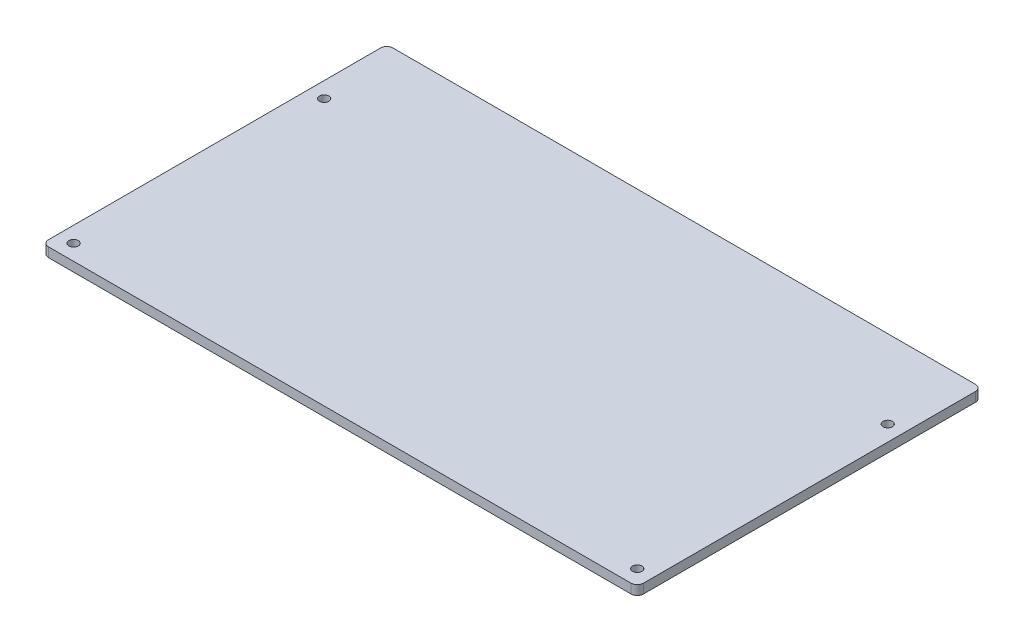
ISO-10303-21;
HEADER;
FILE_DESCRIPTION(('STEP AP214'),'2;1');
FILE_NAME('part.step','',(''),(''),'','','');
FILE_SCHEMA(('AUTOMOTIVE_DESIGN { 1 0 10303 214 1 1 1 1 }'));
ENDSEC;
DATA;
#1=APPLICATION_CONTEXT('core data for automotive mechanical design processes');
#2=APPLICATION_PROTOCOL_DEFINITION('international standard','automotive_design',2000,#1);
#3=PRODUCT_CONTEXT('',#1,'mechanical');
#4=PRODUCT('Part','Part','',(#3));
#5=PRODUCT_RELATED_PRODUCT_CATEGORY('part','',(#4));
#6=PRODUCT_DEFINITION_FORMATION('','',#4);
#7=PRODUCT_DEFINITION_CONTEXT('part definition',#1,'design');
#8=PRODUCT_DEFINITION('design','',#6,#7);
#9=PRODUCT_DEFINITION_SHAPE('','',#8);
#10=(LENGTH_UNIT() NAMED_UNIT(*) SI_UNIT(.MILLI.,.METRE.));
#11=(NAMED_UNIT(*) PLANE_ANGLE_UNIT() SI_UNIT($,.RADIAN.));
#12=(NAMED_UNIT(*) SI_UNIT($,.STERADIAN.) SOLID_ANGLE_UNIT());
#13=UNCERTAINTY_MEASURE_WITH_UNIT(LENGTH_MEASURE(1.E-05),#10,'distance_accuracy_value','');
#14=(GEOMETRIC_REPRESENTATION_CONTEXT(3) GLOBAL_UNCERTAINTY_ASSIGNED_CONTEXT((#13)) GLOBAL_UNIT_ASSIGNED_CONTEXT((#10,
#11,#12)) REPRESENTATION_CONTEXT('',''));
#15=CARTESIAN_POINT('',(0.,0.,0.));
#16=DIRECTION('',(0.,0.,1.));
#17=DIRECTION('',(1.,0.,0.));
#18=AXIS2_PLACEMENT_3D('',#15,#16,#17);
#19=CARTESIAN_POINT('',(-95.,3.,-55.));
#20=DIRECTION('',(1.,0.,0.));
#21=DIRECTION('',(0.,0.,-1.));
#22=AXIS2_PLACEMENT_3D('',#19,#20,#21);
#23=PLANE('',#22);
#24=DIRECTION('',(0.,0.,1.));
#25=VECTOR('',#24,1.);
#26=CARTESIAN_POINT('',(-95.,0.,-55.));
#27=LINE('',#26,#25);
#28=CARTESIAN_POINT('',(-95.,0.,-53.));
#29=VERTEX_POINT('',#28);
#30=CARTESIAN_POINT('',(-95.,0.,53.));
#31=VERTEX_POINT('',#30);
#32=EDGE_CURVE('E143',#29,#31,#27,.T.);
#33=ORIENTED_EDGE('',*,*,#32,.T.);
#34=DIRECTION('',(0.,-1.,0.));
#35=VECTOR('',#34,1.);
#36=CARTESIAN_POINT('',(-95.,3.,53.));
#37=LINE('',#36,#35);
#38=CARTESIAN_POINT('',(-95.,3.,53.));
#39=VERTEX_POINT('',#38);
#40=EDGE_CURVE('E13',#31,#39,#37,.F.);
#41=ORIENTED_EDGE('',*,*,#40,.T.);
#42=DIRECTION('',(0.,0.,1.));
#43=VECTOR('',#42,1.);
#44=CARTESIAN_POINT('',(-95.,3.,-55.));
#45=LINE('',#44,#43);
#46=CARTESIAN_POINT('',(-95.,3.,-53.));
#47=VERTEX_POINT('',#46);
#48=EDGE_CURVE('E141',#47,#39,#45,.T.);
#49=ORIENTED_EDGE('',*,*,#48,.F.);
#50=DIRECTION('',(0.,-1.,0.));
#51=VECTOR('',#50,1.);
#52=CARTESIAN_POINT('',(-95.,3.,-53.));
#53=LINE('',#52,#51);
#54=EDGE_CURVE('E55',#47,#29,#53,.T.);
#55=ORIENTED_EDGE('',*,*,#54,.T.);
#56=EDGE_LOOP('',(#33,#41,#49,#55));
#57=FACE_BOUND('',#56,.T.);
#58=ADVANCED_FACE('F47',(#57),#23,.F.);
#59=CARTESIAN_POINT('',(-95.,3.,55.));
#60=DIRECTION('',(0.,0.,-1.));
#61=DIRECTION('',(-1.,0.,0.));
#62=AXIS2_PLACEMENT_3D('',#59,#60,#61);
#63=PLANE('',#62);
#64=DIRECTION('',(1.,0.,0.));
#65=VECTOR('',#64,1.);
#66=CARTESIAN_POINT('',(-95.,0.,55.));
#67=LINE('',#66,#65);
#68=CARTESIAN_POINT('',(-93.,0.,55.));
#69=VERTEX_POINT('',#68);
#70=CARTESIAN_POINT('',(93.,0.,55.));
#71=VERTEX_POINT('',#70);
#72=EDGE_CURVE('E139',#69,#71,#67,.T.);
#73=ORIENTED_EDGE('',*,*,#72,.T.);
#74=DIRECTION('',(0.,-1.,0.));
#75=VECTOR('',#74,1.);
#76=CARTESIAN_POINT('',(93.,3.,55.));
#77=LINE('',#76,#75);
#78=CARTESIAN_POINT('',(93.,3.,55.));
#79=VERTEX_POINT('',#78);
#80=EDGE_CURVE('E118',#71,#79,#77,.F.);
#81=ORIENTED_EDGE('',*,*,#80,.T.);
#82=DIRECTION('',(1.,0.,0.));
#83=VECTOR('',#82,1.);
#84=CARTESIAN_POINT('',(-95.,3.,55.));
#85=LINE('',#84,#83);
#86=CARTESIAN_POINT('',(-93.,3.,55.));
#87=VERTEX_POINT('',#86);
#88=EDGE_CURVE('E183',#87,#79,#85,.T.);
#89=ORIENTED_EDGE('',*,*,#88,.F.);
#90=DIRECTION('',(0.,-1.,0.));
#91=VECTOR('',#90,1.);
#92=CARTESIAN_POINT('',(-93.,3.,55.));
#93=LINE('',#92,#91);
#94=EDGE_CURVE('E123',#87,#69,#93,.T.);
#95=ORIENTED_EDGE('',*,*,#94,.T.);
#96=EDGE_LOOP('',(#73,#81,#89,#95));
#97=FACE_BOUND('',#96,.T.);
#98=ADVANCED_FACE('F231',(#97),#63,.F.);
#99=CARTESIAN_POINT('',(95.,3.,-55.));
#100=DIRECTION('',(-1.,0.,0.));
#101=DIRECTION('',(0.,0.,1.));
#102=AXIS2_PLACEMENT_3D('',#99,#100,#101);
#103=PLANE('',#102);
#104=DIRECTION('',(0.,0.,-1.));
#105=VECTOR('',#104,1.);
#106=CARTESIAN_POINT('',(95.,3.,-55.));
#107=LINE('',#106,#105);
#108=CARTESIAN_POINT('',(95.,3.,53.));
#109=VERTEX_POINT('',#108);
#110=CARTESIAN_POINT('',(95.,3.,-53.));
#111=VERTEX_POINT('',#110);
#112=EDGE_CURVE('E132',#109,#111,#107,.T.);
#113=ORIENTED_EDGE('',*,*,#112,.F.);
#114=DIRECTION('',(0.,-1.,0.));
#115=VECTOR('',#114,1.);
#116=CARTESIAN_POINT('',(95.,3.,53.));
#117=LINE('',#116,#115);
#118=CARTESIAN_POINT('',(95.,0.,53.));
#119=VERTEX_POINT('',#118);
#120=EDGE_CURVE('E117',#109,#119,#117,.T.);
#121=ORIENTED_EDGE('',*,*,#120,.T.);
#122=DIRECTION('',(0.,0.,-1.));
#123=VECTOR('',#122,1.);
#124=CARTESIAN_POINT('',(95.,0.,-55.));
#125=LINE('',#124,#123);
#126=CARTESIAN_POINT('',(95.,0.,-53.));
#127=VERTEX_POINT('',#126);
#128=EDGE_CURVE('E130',#119,#127,#125,.T.);
#129=ORIENTED_EDGE('',*,*,#128,.T.);
#130=DIRECTION('',(0.,-1.,0.));
#131=VECTOR('',#130,1.);
#132=CARTESIAN_POINT('',(95.,3.,-53.));
#133=LINE('',#132,#131);
#134=EDGE_CURVE('E134',#127,#111,#133,.F.);
#135=ORIENTED_EDGE('',*,*,#134,.T.);
#136=EDGE_LOOP('',(#113,#121,#129,#135));
#137=FACE_BOUND('',#136,.T.);
#138=ADVANCED_FACE('F129',(#137),#103,.F.);
#139=CARTESIAN_POINT('',(-95.,3.,-55.));
#140=DIRECTION('',(0.,0.,1.));
#141=DIRECTION('',(1.,0.,0.));
#142=AXIS2_PLACEMENT_3D('',#139,#140,#141);
#143=PLANE('',#142);
#144=DIRECTION('',(-1.,0.,0.));
#145=VECTOR('',#144,1.);
#146=CARTESIAN_POINT('',(-95.,3.,-55.));
#147=LINE('',#146,#145);
#148=CARTESIAN_POINT('',(93.,3.,-55.));
#149=VERTEX_POINT('',#148);
#150=CARTESIAN_POINT('',(-93.,3.,-55.));
#151=VERTEX_POINT('',#150);
#152=EDGE_CURVE('E147',#149,#151,#147,.T.);
#153=ORIENTED_EDGE('',*,*,#152,.F.);
#154=DIRECTION('',(0.,-1.,0.));
#155=VECTOR('',#154,1.);
#156=CARTESIAN_POINT('',(93.,3.,-55.));
#157=LINE('',#156,#155);
#158=CARTESIAN_POINT('',(93.,0.,-55.));
#159=VERTEX_POINT('',#158);
#160=EDGE_CURVE('E164',#149,#159,#157,.T.);
#161=ORIENTED_EDGE('',*,*,#160,.T.);
#162=DIRECTION('',(-1.,0.,0.));
#163=VECTOR('',#162,1.);
#164=CARTESIAN_POINT('',(-95.,0.,-55.));
#165=LINE('',#164,#163);
#166=CARTESIAN_POINT('',(-93.,0.,-55.));
#167=VERTEX_POINT('',#166);
#168=EDGE_CURVE('E138',#159,#167,#165,.T.);
#169=ORIENTED_EDGE('',*,*,#168,.T.);
#170=DIRECTION('',(0.,-1.,0.));
#171=VECTOR('',#170,1.);
#172=CARTESIAN_POINT('',(-93.,3.,-55.));
#173=LINE('',#172,#171);
#174=EDGE_CURVE('E62',#167,#151,#173,.F.);
#175=ORIENTED_EDGE('',*,*,#174,.T.);
#176=EDGE_LOOP('',(#153,#161,#169,#175));
#177=FACE_BOUND('',#176,.T.);
#178=ADVANCED_FACE('F220',(#177),#143,.F.);
#179=CARTESIAN_POINT('',(0.,3.,0.));
#180=DIRECTION('',(0.,1.,0.));
#181=DIRECTION('',(0.,0.,1.));
#182=AXIS2_PLACEMENT_3D('',#179,#180,#181);
#183=PLANE('',#182);
#184=CARTESIAN_POINT('',(-90.,3.,-30.));
#185=DIRECTION('',(0.,1.,0.));
#186=DIRECTION('',(0.,0.,1.));
#187=AXIS2_PLACEMENT_3D('',#184,#185,#186);
#188=CIRCLE('',#187,1.5);
#189=CARTESIAN_POINT('',(-90.,3.,-28.5));
#190=VERTEX_POINT('',#189);
#191=EDGE_CURVE('E202',#190,#190,#188,.T.);
#192=ORIENTED_EDGE('',*,*,#191,.F.);
#193=EDGE_LOOP('',(#192));
#194=FACE_BOUND('',#193,.T.);
#195=CARTESIAN_POINT('',(90.,3.,-30.));
#196=DIRECTION('',(0.,1.,0.));
#197=DIRECTION('',(0.,0.,1.));
#198=AXIS2_PLACEMENT_3D('',#195,#196,#197);
#199=CIRCLE('',#198,1.5);
#200=CARTESIAN_POINT('',(90.,3.,-28.5));
#201=VERTEX_POINT('',#200);
#202=EDGE_CURVE('E196',#201,#201,#199,.T.);
#203=ORIENTED_EDGE('',*,*,#202,.F.);
#204=EDGE_LOOP('',(#203));
#205=FACE_BOUND('',#204,.T.);
#206=CARTESIAN_POINT('',(90.,3.,50.));
#207=DIRECTION('',(0.,1.,0.));
#208=DIRECTION('',(0.,0.,1.));
#209=AXIS2_PLACEMENT_3D('',#206,#207,#208);
#210=CIRCLE('',#209,1.5);
#211=CARTESIAN_POINT('',(90.,3.,51.5));
#212=VERTEX_POINT('',#211);
#213=EDGE_CURVE('E190',#212,#212,#210,.T.);
#214=ORIENTED_EDGE('',*,*,#213,.F.);
#215=EDGE_LOOP('',(#214));
#216=FACE_BOUND('',#215,.T.);
#217=CARTESIAN_POINT('',(-90.,3.,50.));
#218=DIRECTION('',(0.,1.,0.));
#219=DIRECTION('',(0.,0.,1.));
#220=AXIS2_PLACEMENT_3D('',#217,#218,#219);
#221=CIRCLE('',#220,1.5);
#222=CARTESIAN_POINT('',(-90.,3.,51.5));
#223=VERTEX_POINT('',#222);
#224=EDGE_CURVE('E178',#223,#223,#221,.T.);
#225=ORIENTED_EDGE('',*,*,#224,.F.);
#226=EDGE_LOOP('',(#225));
#227=FACE_BOUND('',#226,.T.);
#228=ORIENTED_EDGE('',*,*,#88,.T.);
#229=CARTESIAN_POINT('',(93.,3.,53.));
#230=DIRECTION('',(0.,1.,0.));
#231=DIRECTION('',(0.,0.,1.));
#232=AXIS2_PLACEMENT_3D('',#229,#230,#231);
#233=CIRCLE('',#232,2.);
#234=EDGE_CURVE('E161',#79,#109,#233,.T.);
#235=ORIENTED_EDGE('',*,*,#234,.T.);
#236=ORIENTED_EDGE('',*,*,#112,.T.);
#237=CARTESIAN_POINT('',(93.,3.,-53.));
#238=DIRECTION('',(0.,1.,0.));
#239=DIRECTION('',(0.,0.,1.));
#240=AXIS2_PLACEMENT_3D('',#237,#238,#239);
#241=CIRCLE('',#240,2.);
#242=EDGE_CURVE('E69',#111,#149,#241,.T.);
#243=ORIENTED_EDGE('',*,*,#242,.T.);
#244=ORIENTED_EDGE('',*,*,#152,.T.);
#245=CARTESIAN_POINT('',(-93.,3.,-53.));
#246=DIRECTION('',(0.,1.,0.));
#247=DIRECTION('',(0.,0.,1.));
#248=AXIS2_PLACEMENT_3D('',#245,#246,#247);
#249=CIRCLE('',#248,2.);
#250=EDGE_CURVE('E156',#151,#47,#249,.T.);
#251=ORIENTED_EDGE('',*,*,#250,.T.);
#252=ORIENTED_EDGE('',*,*,#48,.T.);
#253=CARTESIAN_POINT('',(-93.,3.,53.));
#254=DIRECTION('',(0.,1.,0.));
#255=DIRECTION('',(0.,0.,1.));
#256=AXIS2_PLACEMENT_3D('',#253,#254,#255);
#257=CIRCLE('',#256,2.);
#258=EDGE_CURVE('E158',#39,#87,#257,.T.);
#259=ORIENTED_EDGE('',*,*,#258,.T.);
#260=EDGE_LOOP('',(#228,#235,#236,#243,#244,#251,#252,#259));
#261=FACE_BOUND('',#260,.T.);
#262=ADVANCED_FACE('F217',(#194,#205,#216,#227,#261),#183,.T.);
#263=CARTESIAN_POINT('',(0.,0.,0.));
#264=DIRECTION('',(0.,1.,0.));
#265=DIRECTION('',(0.,0.,1.));
#266=AXIS2_PLACEMENT_3D('',#263,#264,#265);
#267=PLANE('',#266);
#268=CARTESIAN_POINT('',(-90.,0.,-30.));
#269=DIRECTION('',(0.,1.,0.));
#270=DIRECTION('',(0.,0.,1.));
#271=AXIS2_PLACEMENT_3D('',#268,#269,#270);
#272=CIRCLE('',#271,1.5);
#273=CARTESIAN_POINT('',(-90.,0.,-28.5));
#274=VERTEX_POINT('',#273);
#275=EDGE_CURVE('E188',#274,#274,#272,.T.);
#276=ORIENTED_EDGE('',*,*,#275,.T.);
#277=EDGE_LOOP('',(#276));
#278=FACE_BOUND('',#277,.T.);
#279=CARTESIAN_POINT('',(90.,0.,-30.));
#280=DIRECTION('',(0.,1.,0.));
#281=DIRECTION('',(0.,0.,1.));
#282=AXIS2_PLACEMENT_3D('',#279,#280,#281);
#283=CIRCLE('',#282,1.5);
#284=CARTESIAN_POINT('',(90.,0.,-28.5));
#285=VERTEX_POINT('',#284);
#286=EDGE_CURVE('E199',#285,#285,#283,.T.);
#287=ORIENTED_EDGE('',*,*,#286,.T.);
#288=EDGE_LOOP('',(#287));
#289=FACE_BOUND('',#288,.T.);
#290=CARTESIAN_POINT('',(90.,0.,50.));
#291=DIRECTION('',(0.,1.,0.));
#292=DIRECTION('',(0.,0.,1.));
#293=AXIS2_PLACEMENT_3D('',#290,#291,#292);
#294=CIRCLE('',#293,1.5);
#295=CARTESIAN_POINT('',(90.,0.,51.5));
#296=VERTEX_POINT('',#295);
#297=EDGE_CURVE('E193',#296,#296,#294,.T.);
#298=ORIENTED_EDGE('',*,*,#297,.T.);
#299=EDGE_LOOP('',(#298));
#300=FACE_BOUND('',#299,.T.);
#301=CARTESIAN_POINT('',(-90.,0.,50.));
#302=DIRECTION('',(0.,1.,0.));
#303=DIRECTION('',(0.,0.,1.));
#304=AXIS2_PLACEMENT_3D('',#301,#302,#303);
#305=CIRCLE('',#304,1.5);
#306=CARTESIAN_POINT('',(-90.,0.,51.5));
#307=VERTEX_POINT('',#306);
#308=EDGE_CURVE('E176',#307,#307,#305,.T.);
#309=ORIENTED_EDGE('',*,*,#308,.T.);
#310=EDGE_LOOP('',(#309));
#311=FACE_BOUND('',#310,.T.);
#312=ORIENTED_EDGE('',*,*,#128,.F.);
#313=CARTESIAN_POINT('',(93.,0.,53.));
#314=DIRECTION('',(0.,1.,0.));
#315=DIRECTION('',(0.,0.,1.));
#316=AXIS2_PLACEMENT_3D('',#313,#314,#315);
#317=CIRCLE('',#316,2.);
#318=EDGE_CURVE('E113',#119,#71,#317,.F.);
#319=ORIENTED_EDGE('',*,*,#318,.T.);
#320=ORIENTED_EDGE('',*,*,#72,.F.);
#321=CARTESIAN_POINT('',(-93.,0.,53.));
#322=DIRECTION('',(0.,1.,0.));
#323=DIRECTION('',(0.,0.,1.));
#324=AXIS2_PLACEMENT_3D('',#321,#322,#323);
#325=CIRCLE('',#324,2.);
#326=EDGE_CURVE('E150',#69,#31,#325,.F.);
#327=ORIENTED_EDGE('',*,*,#326,.T.);
#328=ORIENTED_EDGE('',*,*,#32,.F.);
#329=CARTESIAN_POINT('',(-93.,0.,-53.));
#330=DIRECTION('',(0.,1.,0.));
#331=DIRECTION('',(0.,0.,1.));
#332=AXIS2_PLACEMENT_3D('',#329,#330,#331);
#333=CIRCLE('',#332,2.);
#334=EDGE_CURVE('E133',#29,#167,#333,.F.);
#335=ORIENTED_EDGE('',*,*,#334,.T.);
#336=ORIENTED_EDGE('',*,*,#168,.F.);
#337=CARTESIAN_POINT('',(93.,0.,-53.));
#338=DIRECTION('',(0.,1.,0.));
#339=DIRECTION('',(0.,0.,1.));
#340=AXIS2_PLACEMENT_3D('',#337,#338,#339);
#341=CIRCLE('',#340,2.);
#342=EDGE_CURVE('E124',#159,#127,#341,.F.);
#343=ORIENTED_EDGE('',*,*,#342,.T.);
#344=EDGE_LOOP('',(#312,#319,#320,#327,#328,#335,#336,#343));
#345=FACE_BOUND('',#344,.T.);
#346=ADVANCED_FACE('F136',(#278,#289,#300,#311,#345),#267,.F.);
#347=CARTESIAN_POINT('',(-90.,0.,50.));
#348=DIRECTION('',(0.,1.,0.));
#349=DIRECTION('',(0.,0.,1.));
#350=AXIS2_PLACEMENT_3D('',#347,#348,#349);
#351=CYLINDRICAL_SURFACE('',#350,1.5);
#352=ORIENTED_EDGE('',*,*,#308,.F.);
#353=EDGE_LOOP('',(#352));
#354=FACE_BOUND('',#353,.T.);
#355=ORIENTED_EDGE('',*,*,#224,.T.);
#356=EDGE_LOOP('',(#355));
#357=FACE_BOUND('',#356,.T.);
#358=ADVANCED_FACE('F261',(#354,#357),#351,.F.);
#359=CARTESIAN_POINT('',(90.,0.,50.));
#360=DIRECTION('',(0.,1.,0.));
#361=DIRECTION('',(0.,0.,1.));
#362=AXIS2_PLACEMENT_3D('',#359,#360,#361);
#363=CYLINDRICAL_SURFACE('',#362,1.5);
#364=ORIENTED_EDGE('',*,*,#297,.F.);
#365=EDGE_LOOP('',(#364));
#366=FACE_BOUND('',#365,.T.);
#367=ORIENTED_EDGE('',*,*,#213,.T.);
#368=EDGE_LOOP('',(#367));
#369=FACE_BOUND('',#368,.T.);
#370=ADVANCED_FACE('F265',(#366,#369),#363,.F.);
#371=CARTESIAN_POINT('',(90.,0.,-30.));
#372=DIRECTION('',(0.,1.,0.));
#373=DIRECTION('',(0.,0.,1.));
#374=AXIS2_PLACEMENT_3D('',#371,#372,#373);
#375=CYLINDRICAL_SURFACE('',#374,1.5);
#376=ORIENTED_EDGE('',*,*,#286,.F.);
#377=EDGE_LOOP('',(#376));
#378=FACE_BOUND('',#377,.T.);
#379=ORIENTED_EDGE('',*,*,#202,.T.);
#380=EDGE_LOOP('',(#379));
#381=FACE_BOUND('',#380,.T.);
#382=ADVANCED_FACE('F213',(#378,#381),#375,.F.);
#383=CARTESIAN_POINT('',(-90.,0.,-30.));
#384=DIRECTION('',(0.,1.,0.));
#385=DIRECTION('',(0.,0.,1.));
#386=AXIS2_PLACEMENT_3D('',#383,#384,#385);
#387=CYLINDRICAL_SURFACE('',#386,1.5);
#388=ORIENTED_EDGE('',*,*,#275,.F.);
#389=EDGE_LOOP('',(#388));
#390=FACE_BOUND('',#389,.T.);
#391=ORIENTED_EDGE('',*,*,#191,.T.);
#392=EDGE_LOOP('',(#391));
#393=FACE_BOUND('',#392,.T.);
#394=ADVANCED_FACE('F210',(#390,#393),#387,.F.);
#395=CARTESIAN_POINT('',(93.,3.,53.));
#396=DIRECTION('',(0.,-1.,0.));
#397=DIRECTION('',(0.,0.,-1.));
#398=AXIS2_PLACEMENT_3D('',#395,#396,#397);
#399=CYLINDRICAL_SURFACE('',#398,2.);
#400=ORIENTED_EDGE('',*,*,#234,.F.);
#401=ORIENTED_EDGE('',*,*,#80,.F.);
#402=ORIENTED_EDGE('',*,*,#318,.F.);
#403=ORIENTED_EDGE('',*,*,#120,.F.);
#404=EDGE_LOOP('',(#400,#401,#402,#403));
#405=FACE_BOUND('',#404,.T.);
#406=ADVANCED_FACE('F116',(#405),#399,.T.);
#407=CARTESIAN_POINT('',(93.,3.,-53.));
#408=DIRECTION('',(0.,-1.,0.));
#409=DIRECTION('',(0.,0.,-1.));
#410=AXIS2_PLACEMENT_3D('',#407,#408,#409);
#411=CYLINDRICAL_SURFACE('',#410,2.);
#412=ORIENTED_EDGE('',*,*,#242,.F.);
#413=ORIENTED_EDGE('',*,*,#134,.F.);
#414=ORIENTED_EDGE('',*,*,#342,.F.);
#415=ORIENTED_EDGE('',*,*,#160,.F.);
#416=EDGE_LOOP('',(#412,#413,#414,#415));
#417=FACE_BOUND('',#416,.T.);
#418=ADVANCED_FACE('F238',(#417),#411,.T.);
#419=CARTESIAN_POINT('',(-93.,3.,53.));
#420=DIRECTION('',(0.,-1.,0.));
#421=DIRECTION('',(0.,0.,-1.));
#422=AXIS2_PLACEMENT_3D('',#419,#420,#421);
#423=CYLINDRICAL_SURFACE('',#422,2.);
#424=ORIENTED_EDGE('',*,*,#258,.F.);
#425=ORIENTED_EDGE('',*,*,#40,.F.);
#426=ORIENTED_EDGE('',*,*,#326,.F.);
#427=ORIENTED_EDGE('',*,*,#94,.F.);
#428=EDGE_LOOP('',(#424,#425,#426,#427));
#429=FACE_BOUND('',#428,.T.);
#430=ADVANCED_FACE('F233',(#429),#423,.T.);
#431=CARTESIAN_POINT('',(-93.,3.,-53.));
#432=DIRECTION('',(0.,-1.,0.));
#433=DIRECTION('',(0.,0.,-1.));
#434=AXIS2_PLACEMENT_3D('',#431,#432,#433);
#435=CYLINDRICAL_SURFACE('',#434,2.);
#436=ORIENTED_EDGE('',*,*,#250,.F.);
#437=ORIENTED_EDGE('',*,*,#174,.F.);
#438=ORIENTED_EDGE('',*,*,#334,.F.);
#439=ORIENTED_EDGE('',*,*,#54,.F.);
#440=EDGE_LOOP('',(#436,#437,#438,#439));
#441=FACE_BOUND('',#440,.T.);
#442=ADVANCED_FACE('F49',(#441),#435,.T.);
#443=CLOSED_SHELL('',(#58,#98,#138,#178,#262,#346,#358,#370,#382,#394,#406,#418,#430,#442));
#444=MANIFOLD_SOLID_BREP('B2',#443);
#445=ADVANCED_BREP_SHAPE_REPRESENTATION('',(#18,#444),#14);
#446=SHAPE_DEFINITION_REPRESENTATION(#9,#445);
ENDSEC;
END-ISO-10303-21;
